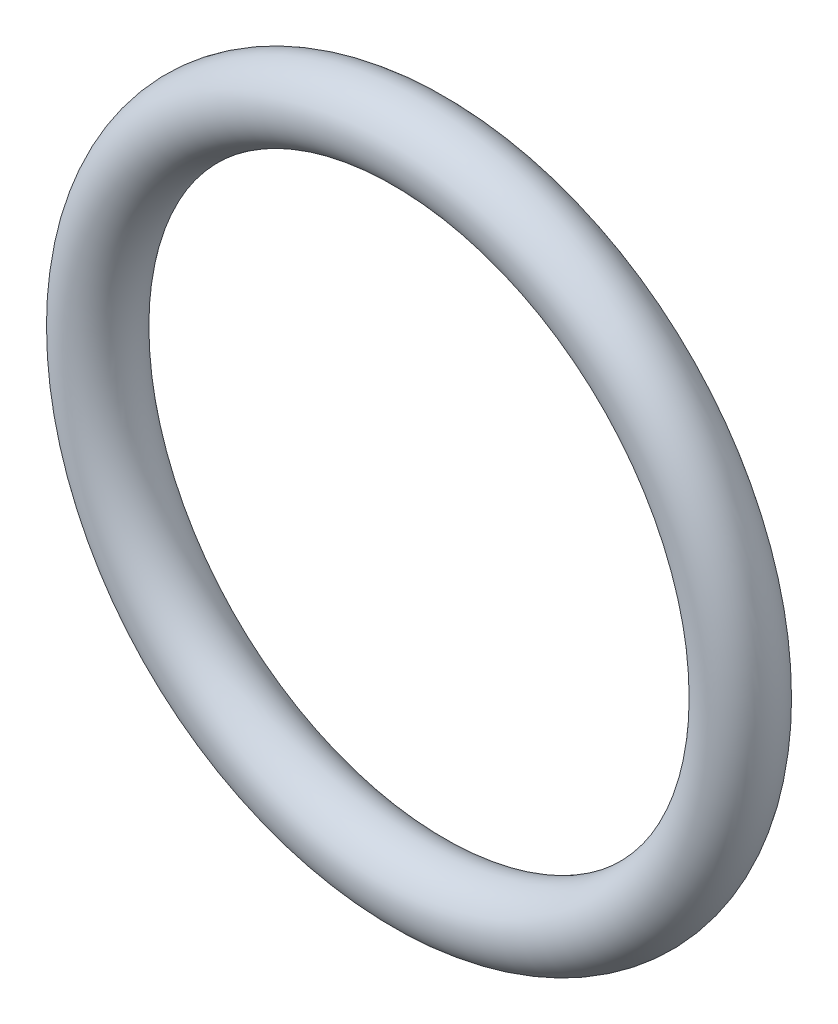
ISO-10303-21;
HEADER;
FILE_DESCRIPTION(('STEP AP214'),'2;1');
FILE_NAME('part.step','',(''),(''),'','','');
FILE_SCHEMA(('AUTOMOTIVE_DESIGN { 1 0 10303 214 1 1 1 1 }'));
ENDSEC;
DATA;
#1=APPLICATION_CONTEXT('core data for automotive mechanical design processes');
#2=APPLICATION_PROTOCOL_DEFINITION('international standard','automotive_design',2000,#1);
#3=PRODUCT_CONTEXT('',#1,'mechanical');
#4=PRODUCT('Part','Part','',(#3));
#5=PRODUCT_RELATED_PRODUCT_CATEGORY('part','',(#4));
#6=PRODUCT_DEFINITION_FORMATION('','',#4);
#7=PRODUCT_DEFINITION_CONTEXT('part definition',#1,'design');
#8=PRODUCT_DEFINITION('design','',#6,#7);
#9=PRODUCT_DEFINITION_SHAPE('','',#8);
#10=(LENGTH_UNIT() NAMED_UNIT(*) SI_UNIT(.MILLI.,.METRE.));
#11=(NAMED_UNIT(*) PLANE_ANGLE_UNIT() SI_UNIT($,.RADIAN.));
#12=(NAMED_UNIT(*) SI_UNIT($,.STERADIAN.) SOLID_ANGLE_UNIT());
#13=UNCERTAINTY_MEASURE_WITH_UNIT(LENGTH_MEASURE(1.E-05),#10,'distance_accuracy_value','');
#14=(GEOMETRIC_REPRESENTATION_CONTEXT(3) GLOBAL_UNCERTAINTY_ASSIGNED_CONTEXT((#13)) GLOBAL_UNIT_ASSIGNED_CONTEXT((#10,
#11,#12)) REPRESENTATION_CONTEXT('',''));
#15=CARTESIAN_POINT('',(0.,0.,0.));
#16=DIRECTION('',(0.,0.,1.));
#17=DIRECTION('',(1.,0.,0.));
#18=AXIS2_PLACEMENT_3D('',#15,#16,#17);
#19=CARTESIAN_POINT('',(0.,0.,0.));
#20=DIRECTION('',(0.,0.,1.));
#21=DIRECTION('',(1.,0.,0.));
#22=AXIS2_PLACEMENT_3D('',#19,#20,#21);
#23=TOROIDAL_SURFACE('',#22,7.8867,0.889);
#24=CARTESIAN_POINT('',(8.7757,0.,0.));
#25=VERTEX_POINT('',#24);
#26=VERTEX_LOOP('',#25);
#27=FACE_BOUND('',#26,.T.);
#28=ADVANCED_FACE('F30',(#27),#23,.T.);
#29=CLOSED_SHELL('',(#28));
#30=MANIFOLD_SOLID_BREP('B2',#29);
#31=ADVANCED_BREP_SHAPE_REPRESENTATION('',(#18,#30),#14);
#32=SHAPE_DEFINITION_REPRESENTATION(#9,#31);
ENDSEC;
END-ISO-10303-21;
